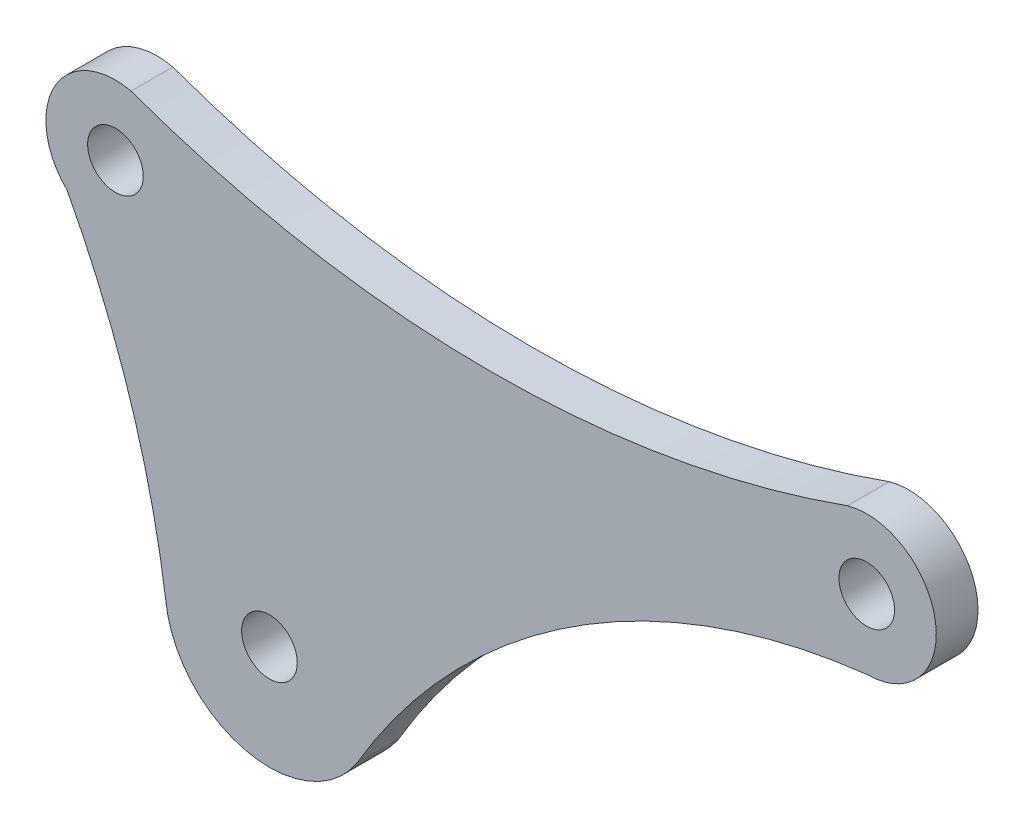
ISO-10303-21;
HEADER;
FILE_DESCRIPTION(('STEP AP214'),'2;1');
FILE_NAME('part.step','',(''),(''),'','','');
FILE_SCHEMA(('AUTOMOTIVE_DESIGN { 1 0 10303 214 1 1 1 1 }'));
ENDSEC;
DATA;
#1=APPLICATION_CONTEXT('core data for automotive mechanical design processes');
#2=APPLICATION_PROTOCOL_DEFINITION('international standard','automotive_design',2000,#1);
#3=PRODUCT_CONTEXT('',#1,'mechanical');
#4=PRODUCT('Part','Part','',(#3));
#5=PRODUCT_RELATED_PRODUCT_CATEGORY('part','',(#4));
#6=PRODUCT_DEFINITION_FORMATION('','',#4);
#7=PRODUCT_DEFINITION_CONTEXT('part definition',#1,'design');
#8=PRODUCT_DEFINITION('design','',#6,#7);
#9=PRODUCT_DEFINITION_SHAPE('','',#8);
#10=(LENGTH_UNIT() NAMED_UNIT(*) SI_UNIT(.MILLI.,.METRE.));
#11=(NAMED_UNIT(*) PLANE_ANGLE_UNIT() SI_UNIT($,.RADIAN.));
#12=(NAMED_UNIT(*) SI_UNIT($,.STERADIAN.) SOLID_ANGLE_UNIT());
#13=UNCERTAINTY_MEASURE_WITH_UNIT(LENGTH_MEASURE(1.E-05),#10,'distance_accuracy_value','');
#14=(GEOMETRIC_REPRESENTATION_CONTEXT(3) GLOBAL_UNCERTAINTY_ASSIGNED_CONTEXT((#13)) GLOBAL_UNIT_ASSIGNED_CONTEXT((#10,
#11,#12)) REPRESENTATION_CONTEXT('',''));
#15=CARTESIAN_POINT('',(0.,0.,0.));
#16=DIRECTION('',(0.,0.,1.));
#17=DIRECTION('',(1.,0.,0.));
#18=AXIS2_PLACEMENT_3D('',#15,#16,#17);
#19=CARTESIAN_POINT('',(11.0700000000211,-24.7499999999528,1.5));
#20=DIRECTION('',(0.,0.,-1.));
#21=DIRECTION('',(-1.,0.,0.));
#22=AXIS2_PLACEMENT_3D('',#19,#20,#21);
#23=CYLINDRICAL_SURFACE('',#22,7.50000000000226);
#24=CARTESIAN_POINT('',(11.0700000000211,-24.7499999999528,-1.5));
#25=DIRECTION('',(0.,0.,1.));
#26=DIRECTION('',(1.,0.,0.));
#27=AXIS2_PLACEMENT_3D('',#24,#25,#26);
#28=CIRCLE('',#27,7.50000000000226);
#29=CARTESIAN_POINT('',(3.61048778325129,-25.5282528431186,-1.5));
#30=VERTEX_POINT('',#29);
#31=CARTESIAN_POINT('',(17.3425430529048,-28.8615938088978,-1.5));
#32=VERTEX_POINT('',#31);
#33=EDGE_CURVE('E128',#30,#32,#28,.T.);
#34=ORIENTED_EDGE('',*,*,#33,.T.);
#35=DIRECTION('',(0.,0.,-1.));
#36=VECTOR('',#35,1.);
#37=CARTESIAN_POINT('',(17.3425430529048,-28.8615938088978,1.5));
#38=LINE('',#37,#36);
#39=CARTESIAN_POINT('',(17.3425430529048,-28.8615938088978,1.5));
#40=VERTEX_POINT('',#39);
#41=EDGE_CURVE('E11',#40,#32,#38,.T.);
#42=ORIENTED_EDGE('',*,*,#41,.F.);
#43=CARTESIAN_POINT('',(11.0700000000211,-24.7499999999528,1.5));
#44=DIRECTION('',(0.,0.,1.));
#45=DIRECTION('',(1.,0.,0.));
#46=AXIS2_PLACEMENT_3D('',#43,#44,#45);
#47=CIRCLE('',#46,7.50000000000226);
#48=CARTESIAN_POINT('',(3.61048778325129,-25.5282528431186,1.5));
#49=VERTEX_POINT('',#48);
#50=EDGE_CURVE('E152',#49,#40,#47,.T.);
#51=ORIENTED_EDGE('',*,*,#50,.F.);
#52=DIRECTION('',(0.,0.,-1.));
#53=VECTOR('',#52,1.);
#54=CARTESIAN_POINT('',(3.61048778325129,-25.5282528431186,1.5));
#55=LINE('',#54,#53);
#56=EDGE_CURVE('E118',#49,#30,#55,.T.);
#57=ORIENTED_EDGE('',*,*,#56,.T.);
#58=EDGE_LOOP('',(#34,#42,#51,#57));
#59=FACE_BOUND('',#58,.T.);
#60=ADVANCED_FACE('F34',(#59),#23,.T.);
#61=CARTESIAN_POINT('',(59.5136673002303,-53.5587608029443,1.5));
#62=DIRECTION('',(0.,0.,-1.));
#63=DIRECTION('',(-1.,0.,0.));
#64=AXIS2_PLACEMENT_3D('',#61,#62,#63);
#65=CYLINDRICAL_SURFACE('',#64,48.870786547949);
#66=CARTESIAN_POINT('',(59.5136673002303,-53.5587608029443,-1.5));
#67=DIRECTION('',(0.,0.,1.));
#68=DIRECTION('',(1.,0.,0.));
#69=AXIS2_PLACEMENT_3D('',#66,#67,#68);
#70=CIRCLE('',#69,48.870786547949);
#71=CARTESIAN_POINT('',(54.,-5.00000000000003,-1.5));
#72=VERTEX_POINT('',#71);
#73=EDGE_CURVE('E131',#32,#72,#70,.F.);
#74=ORIENTED_EDGE('',*,*,#73,.T.);
#75=DIRECTION('',(0.,0.,-1.));
#76=VECTOR('',#75,1.);
#77=CARTESIAN_POINT('',(54.,-5.00000000000003,1.5));
#78=LINE('',#77,#76);
#79=CARTESIAN_POINT('',(54.,-5.00000000000003,1.5));
#80=VERTEX_POINT('',#79);
#81=EDGE_CURVE('E43',#80,#72,#78,.T.);
#82=ORIENTED_EDGE('',*,*,#81,.F.);
#83=CARTESIAN_POINT('',(59.5136673002303,-53.5587608029443,1.5));
#84=DIRECTION('',(0.,0.,1.));
#85=DIRECTION('',(1.,0.,0.));
#86=AXIS2_PLACEMENT_3D('',#83,#84,#85);
#87=CIRCLE('',#86,48.870786547949);
#88=EDGE_CURVE('E87',#40,#80,#87,.F.);
#89=ORIENTED_EDGE('',*,*,#88,.F.);
#90=ORIENTED_EDGE('',*,*,#41,.T.);
#91=EDGE_LOOP('',(#74,#82,#89,#90));
#92=FACE_BOUND('',#91,.T.);
#93=ADVANCED_FACE('F167',(#92),#65,.F.);
#94=CARTESIAN_POINT('',(54.,0.,1.5));
#95=DIRECTION('',(0.,0.,-1.));
#96=DIRECTION('',(-1.,0.,0.));
#97=AXIS2_PLACEMENT_3D('',#94,#95,#96);
#98=CYLINDRICAL_SURFACE('',#97,5.00000000000003);
#99=CARTESIAN_POINT('',(54.,0.,-1.5));
#100=DIRECTION('',(0.,0.,1.));
#101=DIRECTION('',(1.,0.,0.));
#102=AXIS2_PLACEMENT_3D('',#99,#100,#101);
#103=CIRCLE('',#102,5.00000000000003);
#104=CARTESIAN_POINT('',(52.6125611989551,4.80364586260847,-1.5));
#105=VERTEX_POINT('',#104);
#106=EDGE_CURVE('E133',#72,#105,#103,.T.);
#107=ORIENTED_EDGE('',*,*,#106,.T.);
#108=DIRECTION('',(0.,0.,-1.));
#109=VECTOR('',#108,1.);
#110=CARTESIAN_POINT('',(52.6125611989551,4.80364586260847,1.5));
#111=LINE('',#110,#109);
#112=CARTESIAN_POINT('',(52.6125611989551,4.80364586260847,1.5));
#113=VERTEX_POINT('',#112);
#114=EDGE_CURVE('E103',#113,#105,#111,.T.);
#115=ORIENTED_EDGE('',*,*,#114,.F.);
#116=CARTESIAN_POINT('',(54.,0.,1.5));
#117=DIRECTION('',(0.,0.,1.));
#118=DIRECTION('',(1.,0.,0.));
#119=AXIS2_PLACEMENT_3D('',#116,#117,#118);
#120=CIRCLE('',#119,5.00000000000003);
#121=EDGE_CURVE('E111',#80,#113,#120,.T.);
#122=ORIENTED_EDGE('',*,*,#121,.F.);
#123=ORIENTED_EDGE('',*,*,#81,.T.);
#124=EDGE_LOOP('',(#107,#115,#122,#123));
#125=FACE_BOUND('',#124,.T.);
#126=ADVANCED_FACE('F145',(#125),#98,.T.);
#127=CARTESIAN_POINT('',(26.962774357953,76.247422125786,1.5));
#128=DIRECTION('',(0.,0.,-1.));
#129=DIRECTION('',(-1.,0.,0.));
#130=AXIS2_PLACEMENT_3D('',#127,#128,#129);
#131=CYLINDRICAL_SURFACE('',#130,75.9086604527561);
#132=CARTESIAN_POINT('',(26.962774357953,76.247422125786,-1.5));
#133=DIRECTION('',(0.,0.,1.));
#134=DIRECTION('',(1.,0.,0.));
#135=AXIS2_PLACEMENT_3D('',#132,#133,#134);
#136=CIRCLE('',#135,75.9086604527561);
#137=CARTESIAN_POINT('',(1.12213029593981,4.87245560255635,-1.5));
#138=VERTEX_POINT('',#137);
#139=EDGE_CURVE('E102',#138,#105,#136,.T.);
#140=ORIENTED_EDGE('',*,*,#139,.F.);
#141=DIRECTION('',(0.,0.,-1.));
#142=VECTOR('',#141,1.);
#143=CARTESIAN_POINT('',(1.12213029593981,4.87245560255635,1.5));
#144=LINE('',#143,#142);
#145=CARTESIAN_POINT('',(1.12213029593981,4.87245560255635,1.5));
#146=VERTEX_POINT('',#145);
#147=EDGE_CURVE('E96',#146,#138,#144,.T.);
#148=ORIENTED_EDGE('',*,*,#147,.F.);
#149=CARTESIAN_POINT('',(26.962774357953,76.247422125786,1.5));
#150=DIRECTION('',(0.,0.,1.));
#151=DIRECTION('',(1.,0.,0.));
#152=AXIS2_PLACEMENT_3D('',#149,#150,#151);
#153=CIRCLE('',#152,75.9086604527561);
#154=EDGE_CURVE('E100',#146,#113,#153,.T.);
#155=ORIENTED_EDGE('',*,*,#154,.T.);
#156=ORIENTED_EDGE('',*,*,#114,.T.);
#157=EDGE_LOOP('',(#140,#148,#155,#156));
#158=FACE_BOUND('',#157,.T.);
#159=ADVANCED_FACE('F98',(#158),#131,.F.);
#160=CARTESIAN_POINT('',(-7.85677946313346E-12,0.,1.5));
#161=DIRECTION('',(0.,0.,-1.));
#162=DIRECTION('',(-1.,0.,0.));
#163=AXIS2_PLACEMENT_3D('',#160,#161,#162);
#164=CYLINDRICAL_SURFACE('',#163,4.99999999999664);
#165=CARTESIAN_POINT('',(-7.85677946313346E-12,0.,-1.5));
#166=DIRECTION('',(0.,0.,1.));
#167=DIRECTION('',(1.,0.,0.));
#168=AXIS2_PLACEMENT_3D('',#165,#166,#167);
#169=CIRCLE('',#168,4.99999999999664);
#170=CARTESIAN_POINT('',(-3.47200453715132,-3.5979417024212,-1.5));
#171=VERTEX_POINT('',#170);
#172=EDGE_CURVE('E73',#138,#171,#169,.T.);
#173=ORIENTED_EDGE('',*,*,#172,.T.);
#174=DIRECTION('',(0.,0.,-1.));
#175=VECTOR('',#174,1.);
#176=CARTESIAN_POINT('',(-3.47200453715132,-3.5979417024212,1.5));
#177=LINE('',#176,#175);
#178=CARTESIAN_POINT('',(-3.47200453715132,-3.5979417024212,1.5));
#179=VERTEX_POINT('',#178);
#180=EDGE_CURVE('E104',#179,#171,#177,.T.);
#181=ORIENTED_EDGE('',*,*,#180,.F.);
#182=CARTESIAN_POINT('',(-7.85677946313346E-12,0.,1.5));
#183=DIRECTION('',(0.,0.,1.));
#184=DIRECTION('',(1.,0.,0.));
#185=AXIS2_PLACEMENT_3D('',#182,#183,#184);
#186=CIRCLE('',#185,4.99999999999664);
#187=EDGE_CURVE('E106',#146,#179,#186,.T.);
#188=ORIENTED_EDGE('',*,*,#187,.F.);
#189=ORIENTED_EDGE('',*,*,#147,.T.);
#190=EDGE_LOOP('',(#173,#181,#188,#189));
#191=FACE_BOUND('',#190,.T.);
#192=ADVANCED_FACE('F107',(#191),#164,.T.);
#193=CARTESIAN_POINT('',(-7.85677946313346E-12,0.,1.5));
#194=DIRECTION('',(0.,0.,-1.));
#195=DIRECTION('',(-1.,0.,0.));
#196=AXIS2_PLACEMENT_3D('',#193,#194,#195);
#197=CYLINDRICAL_SURFACE('',#196,2.);
#198=CARTESIAN_POINT('',(-7.85677946313346E-12,0.,1.5));
#199=DIRECTION('',(0.,0.,1.));
#200=DIRECTION('',(1.,0.,0.));
#201=AXIS2_PLACEMENT_3D('',#198,#199,#200);
#202=CIRCLE('',#201,2.);
#203=CARTESIAN_POINT('',(1.99999999999214,0.,1.5));
#204=VERTEX_POINT('',#203);
#205=EDGE_CURVE('E260',#204,#204,#202,.T.);
#206=ORIENTED_EDGE('',*,*,#205,.T.);
#207=EDGE_LOOP('',(#206));
#208=FACE_BOUND('',#207,.T.);
#209=CARTESIAN_POINT('',(-7.85677946313346E-12,0.,-1.5));
#210=DIRECTION('',(0.,0.,1.));
#211=DIRECTION('',(1.,0.,0.));
#212=AXIS2_PLACEMENT_3D('',#209,#210,#211);
#213=CIRCLE('',#212,2.);
#214=CARTESIAN_POINT('',(1.99999999999214,0.,-1.5));
#215=VERTEX_POINT('',#214);
#216=EDGE_CURVE('E125',#215,#215,#213,.T.);
#217=ORIENTED_EDGE('',*,*,#216,.F.);
#218=EDGE_LOOP('',(#217));
#219=FACE_BOUND('',#218,.T.);
#220=ADVANCED_FACE('F175',(#208,#219),#197,.F.);
#221=CARTESIAN_POINT('',(54.,0.,1.5));
#222=DIRECTION('',(0.,0.,-1.));
#223=DIRECTION('',(-1.,0.,0.));
#224=AXIS2_PLACEMENT_3D('',#221,#222,#223);
#225=CYLINDRICAL_SURFACE('',#224,2.);
#226=CARTESIAN_POINT('',(54.,0.,1.5));
#227=DIRECTION('',(0.,0.,1.));
#228=DIRECTION('',(1.,0.,0.));
#229=AXIS2_PLACEMENT_3D('',#226,#227,#228);
#230=CIRCLE('',#229,2.);
#231=CARTESIAN_POINT('',(56.,0.,1.5));
#232=VERTEX_POINT('',#231);
#233=EDGE_CURVE('E185',#232,#232,#230,.T.);
#234=ORIENTED_EDGE('',*,*,#233,.T.);
#235=EDGE_LOOP('',(#234));
#236=FACE_BOUND('',#235,.T.);
#237=CARTESIAN_POINT('',(54.,0.,-1.5));
#238=DIRECTION('',(0.,0.,1.));
#239=DIRECTION('',(1.,0.,0.));
#240=AXIS2_PLACEMENT_3D('',#237,#238,#239);
#241=CIRCLE('',#240,2.);
#242=CARTESIAN_POINT('',(56.,0.,-1.5));
#243=VERTEX_POINT('',#242);
#244=EDGE_CURVE('E122',#243,#243,#241,.T.);
#245=ORIENTED_EDGE('',*,*,#244,.F.);
#246=EDGE_LOOP('',(#245));
#247=FACE_BOUND('',#246,.T.);
#248=ADVANCED_FACE('F162',(#236,#247),#225,.F.);
#249=CARTESIAN_POINT('',(11.0700000000211,-24.7499999999528,1.5));
#250=DIRECTION('',(0.,0.,-1.));
#251=DIRECTION('',(-1.,0.,0.));
#252=AXIS2_PLACEMENT_3D('',#249,#250,#251);
#253=CYLINDRICAL_SURFACE('',#252,2.);
#254=CARTESIAN_POINT('',(11.0700000000211,-24.7499999999528,1.5));
#255=DIRECTION('',(0.,0.,1.));
#256=DIRECTION('',(1.,0.,0.));
#257=AXIS2_PLACEMENT_3D('',#254,#255,#256);
#258=CIRCLE('',#257,2.);
#259=CARTESIAN_POINT('',(13.0700000000211,-24.7499999999528,1.5));
#260=VERTEX_POINT('',#259);
#261=EDGE_CURVE('E139',#260,#260,#258,.T.);
#262=ORIENTED_EDGE('',*,*,#261,.T.);
#263=EDGE_LOOP('',(#262));
#264=FACE_BOUND('',#263,.T.);
#265=CARTESIAN_POINT('',(11.0700000000211,-24.7499999999528,-1.5));
#266=DIRECTION('',(0.,0.,1.));
#267=DIRECTION('',(1.,0.,0.));
#268=AXIS2_PLACEMENT_3D('',#265,#266,#267);
#269=CIRCLE('',#268,2.);
#270=CARTESIAN_POINT('',(13.0700000000211,-24.7499999999528,-1.5));
#271=VERTEX_POINT('',#270);
#272=EDGE_CURVE('E119',#271,#271,#269,.T.);
#273=ORIENTED_EDGE('',*,*,#272,.F.);
#274=EDGE_LOOP('',(#273));
#275=FACE_BOUND('',#274,.T.);
#276=ADVANCED_FACE('F36',(#264,#275),#253,.F.);
#277=CARTESIAN_POINT('',(-61.9840868759211,-34.6034979642946,1.5));
#278=DIRECTION('',(0.,0.,-1.));
#279=DIRECTION('',(-1.,0.,0.));
#280=AXIS2_PLACEMENT_3D('',#277,#278,#279);
#281=CYLINDRICAL_SURFACE('',#280,66.2193951854528);
#282=CARTESIAN_POINT('',(-61.9840868759211,-34.6034979642946,-1.5));
#283=DIRECTION('',(0.,0.,1.));
#284=DIRECTION('',(1.,0.,0.));
#285=AXIS2_PLACEMENT_3D('',#282,#283,#284);
#286=CIRCLE('',#285,66.2193951854528);
#287=EDGE_CURVE('E79',#171,#30,#286,.F.);
#288=ORIENTED_EDGE('',*,*,#287,.T.);
#289=ORIENTED_EDGE('',*,*,#56,.F.);
#290=CARTESIAN_POINT('',(-61.9840868759211,-34.6034979642946,1.5));
#291=DIRECTION('',(0.,0.,1.));
#292=DIRECTION('',(1.,0.,0.));
#293=AXIS2_PLACEMENT_3D('',#290,#291,#292);
#294=CIRCLE('',#293,66.2193951854528);
#295=EDGE_CURVE('E51',#179,#49,#294,.F.);
#296=ORIENTED_EDGE('',*,*,#295,.F.);
#297=ORIENTED_EDGE('',*,*,#180,.T.);
#298=EDGE_LOOP('',(#288,#289,#296,#297));
#299=FACE_BOUND('',#298,.T.);
#300=ADVANCED_FACE('F153',(#299),#281,.F.);
#301=CARTESIAN_POINT('',(0.,0.,1.5));
#302=DIRECTION('',(0.,0.,1.));
#303=DIRECTION('',(1.,0.,0.));
#304=AXIS2_PLACEMENT_3D('',#301,#302,#303);
#305=PLANE('',#304);
#306=ORIENTED_EDGE('',*,*,#261,.F.);
#307=EDGE_LOOP('',(#306));
#308=FACE_BOUND('',#307,.T.);
#309=ORIENTED_EDGE('',*,*,#233,.F.);
#310=EDGE_LOOP('',(#309));
#311=FACE_BOUND('',#310,.T.);
#312=ORIENTED_EDGE('',*,*,#205,.F.);
#313=EDGE_LOOP('',(#312));
#314=FACE_BOUND('',#313,.T.);
#315=ORIENTED_EDGE('',*,*,#50,.T.);
#316=ORIENTED_EDGE('',*,*,#88,.T.);
#317=ORIENTED_EDGE('',*,*,#121,.T.);
#318=ORIENTED_EDGE('',*,*,#154,.F.);
#319=ORIENTED_EDGE('',*,*,#187,.T.);
#320=ORIENTED_EDGE('',*,*,#295,.T.);
#321=EDGE_LOOP('',(#315,#316,#317,#318,#319,#320));
#322=FACE_BOUND('',#321,.T.);
#323=ADVANCED_FACE('F109',(#308,#311,#314,#322),#305,.T.);
#324=CARTESIAN_POINT('',(0.,0.,-1.5));
#325=DIRECTION('',(0.,0.,1.));
#326=DIRECTION('',(1.,0.,0.));
#327=AXIS2_PLACEMENT_3D('',#324,#325,#326);
#328=PLANE('',#327);
#329=ORIENTED_EDGE('',*,*,#272,.T.);
#330=EDGE_LOOP('',(#329));
#331=FACE_BOUND('',#330,.T.);
#332=ORIENTED_EDGE('',*,*,#244,.T.);
#333=EDGE_LOOP('',(#332));
#334=FACE_BOUND('',#333,.T.);
#335=ORIENTED_EDGE('',*,*,#216,.T.);
#336=EDGE_LOOP('',(#335));
#337=FACE_BOUND('',#336,.T.);
#338=ORIENTED_EDGE('',*,*,#33,.F.);
#339=ORIENTED_EDGE('',*,*,#287,.F.);
#340=ORIENTED_EDGE('',*,*,#172,.F.);
#341=ORIENTED_EDGE('',*,*,#139,.T.);
#342=ORIENTED_EDGE('',*,*,#106,.F.);
#343=ORIENTED_EDGE('',*,*,#73,.F.);
#344=EDGE_LOOP('',(#338,#339,#340,#341,#342,#343));
#345=FACE_BOUND('',#344,.T.);
#346=ADVANCED_FACE('F148',(#331,#334,#337,#345),#328,.F.);
#347=CLOSED_SHELL('',(#60,#93,#126,#159,#192,#220,#248,#276,#300,#323,#346));
#348=MANIFOLD_SOLID_BREP('B2',#347);
#349=ADVANCED_BREP_SHAPE_REPRESENTATION('',(#18,#348),#14);
#350=SHAPE_DEFINITION_REPRESENTATION(#9,#349);
ENDSEC;
END-ISO-10303-21;
